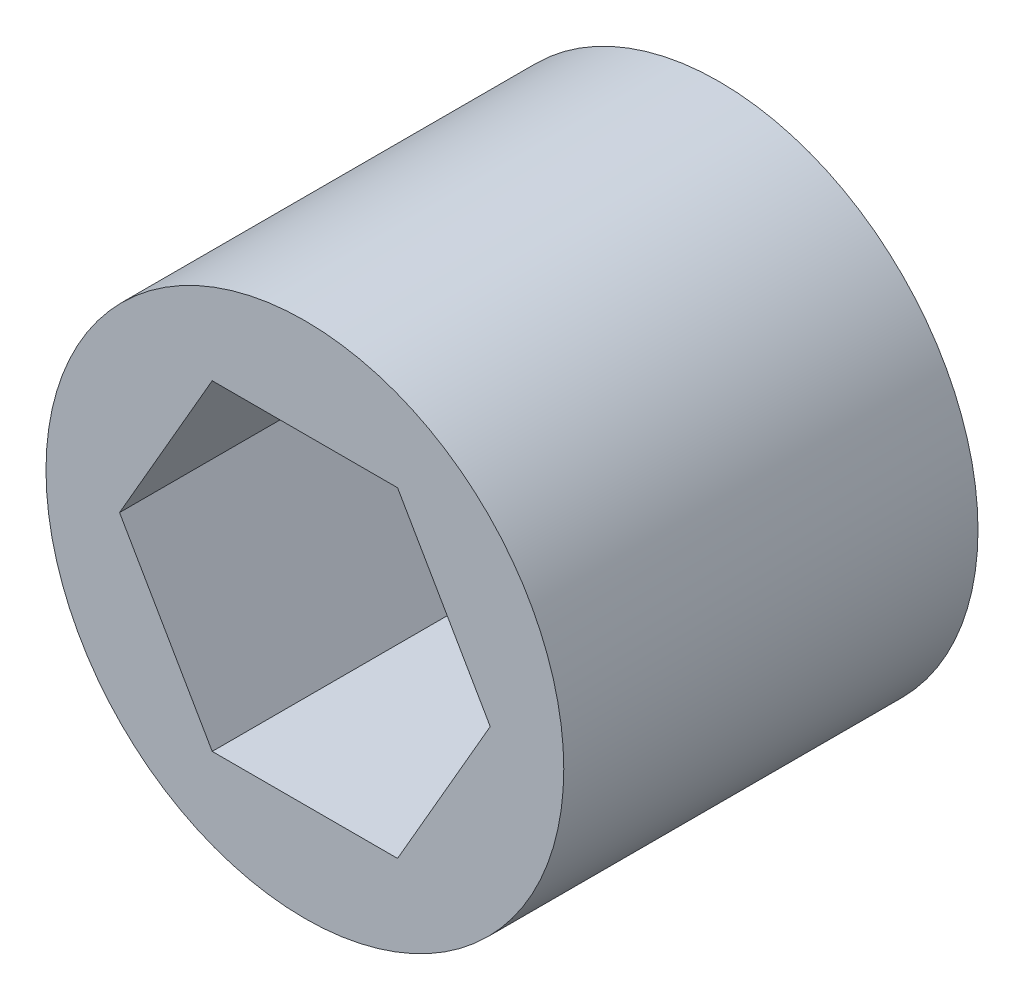
ISO-10303-21;
HEADER;
FILE_DESCRIPTION(('STEP AP214'),'2;1');
FILE_NAME('part.step','',(''),(''),'','','');
FILE_SCHEMA(('AUTOMOTIVE_DESIGN { 1 0 10303 214 1 1 1 1 }'));
ENDSEC;
DATA;
#1=APPLICATION_CONTEXT('core data for automotive mechanical design processes');
#2=APPLICATION_PROTOCOL_DEFINITION('international standard','automotive_design',2000,#1);
#3=PRODUCT_CONTEXT('',#1,'mechanical');
#4=PRODUCT('Part','Part','',(#3));
#5=PRODUCT_RELATED_PRODUCT_CATEGORY('part','',(#4));
#6=PRODUCT_DEFINITION_FORMATION('','',#4);
#7=PRODUCT_DEFINITION_CONTEXT('part definition',#1,'design');
#8=PRODUCT_DEFINITION('design','',#6,#7);
#9=PRODUCT_DEFINITION_SHAPE('','',#8);
#10=(LENGTH_UNIT() NAMED_UNIT(*) SI_UNIT(.MILLI.,.METRE.));
#11=(NAMED_UNIT(*) PLANE_ANGLE_UNIT() SI_UNIT($,.RADIAN.));
#12=(NAMED_UNIT(*) SI_UNIT($,.STERADIAN.) SOLID_ANGLE_UNIT());
#13=UNCERTAINTY_MEASURE_WITH_UNIT(LENGTH_MEASURE(1.E-05),#10,'distance_accuracy_value','');
#14=(GEOMETRIC_REPRESENTATION_CONTEXT(3) GLOBAL_UNCERTAINTY_ASSIGNED_CONTEXT((#13)) GLOBAL_UNIT_ASSIGNED_CONTEXT((#10,
#11,#12)) REPRESENTATION_CONTEXT('',''));
#15=CARTESIAN_POINT('',(0.,0.,0.));
#16=DIRECTION('',(0.,0.,1.));
#17=DIRECTION('',(1.,0.,0.));
#18=AXIS2_PLACEMENT_3D('',#15,#16,#17);
#19=CARTESIAN_POINT('',(0.,0.,8.));
#20=DIRECTION('',(0.,0.,-1.));
#21=DIRECTION('',(-1.,0.,0.));
#22=AXIS2_PLACEMENT_3D('',#19,#20,#21);
#23=CYLINDRICAL_SURFACE('',#22,1.725);
#24=CARTESIAN_POINT('',(0.,0.,0.));
#25=DIRECTION('',(0.,0.,1.));
#26=DIRECTION('',(1.,0.,0.));
#27=AXIS2_PLACEMENT_3D('',#24,#25,#26);
#28=CIRCLE('',#27,1.725);
#29=CARTESIAN_POINT('',(1.725,0.,0.));
#30=VERTEX_POINT('',#29);
#31=EDGE_CURVE('E144',#30,#30,#28,.T.);
#32=ORIENTED_EDGE('',*,*,#31,.F.);
#33=EDGE_LOOP('',(#32));
#34=FACE_BOUND('',#33,.T.);
#35=CARTESIAN_POINT('',(0.,0.,2.7));
#36=DIRECTION('',(0.,0.,1.));
#37=DIRECTION('',(1.,0.,0.));
#38=AXIS2_PLACEMENT_3D('',#35,#36,#37);
#39=CIRCLE('',#38,1.725);
#40=CARTESIAN_POINT('',(1.725,0.,2.7));
#41=VERTEX_POINT('',#40);
#42=EDGE_CURVE('E39',#41,#41,#39,.T.);
#43=ORIENTED_EDGE('',*,*,#42,.T.);
#44=EDGE_LOOP('',(#43));
#45=FACE_BOUND('',#44,.T.);
#46=ADVANCED_FACE('F35',(#34,#45),#23,.F.);
#47=CARTESIAN_POINT('',(0.,0.,8.));
#48=DIRECTION('',(0.,0.,1.));
#49=DIRECTION('',(1.,0.,0.));
#50=AXIS2_PLACEMENT_3D('',#47,#48,#49);
#51=PLANE('',#50);
#52=DIRECTION('',(0.499999999999999,0.866025403784439,0.));
#53=VECTOR('',#52,1.);
#54=CARTESIAN_POINT('',(1.78978583448784,-3.1,8.));
#55=LINE('',#54,#53);
#56=CARTESIAN_POINT('',(1.78978583448784,-3.1,8.));
#57=VERTEX_POINT('',#56);
#58=CARTESIAN_POINT('',(3.57957166897568,0.,8.));
#59=VERTEX_POINT('',#58);
#60=EDGE_CURVE('E52',#57,#59,#55,.T.);
#61=ORIENTED_EDGE('',*,*,#60,.F.);
#62=DIRECTION('',(1.,0.,0.));
#63=VECTOR('',#62,1.);
#64=CARTESIAN_POINT('',(-1.78978583448784,-3.1,8.));
#65=LINE('',#64,#63);
#66=CARTESIAN_POINT('',(-1.78978583448784,-3.1,8.));
#67=VERTEX_POINT('',#66);
#68=EDGE_CURVE('E135',#67,#57,#65,.T.);
#69=ORIENTED_EDGE('',*,*,#68,.F.);
#70=DIRECTION('',(0.5,-0.866025403784438,0.));
#71=VECTOR('',#70,1.);
#72=CARTESIAN_POINT('',(-3.57957166897568,0.,8.));
#73=LINE('',#72,#71);
#74=CARTESIAN_POINT('',(-3.57957166897568,0.,8.));
#75=VERTEX_POINT('',#74);
#76=EDGE_CURVE('E133',#75,#67,#73,.T.);
#77=ORIENTED_EDGE('',*,*,#76,.F.);
#78=DIRECTION('',(-0.499999999999999,-0.866025403784439,0.));
#79=VECTOR('',#78,1.);
#80=CARTESIAN_POINT('',(-1.78978583448784,3.1,8.));
#81=LINE('',#80,#79);
#82=CARTESIAN_POINT('',(-1.78978583448784,3.1,8.));
#83=VERTEX_POINT('',#82);
#84=EDGE_CURVE('E100',#83,#75,#81,.T.);
#85=ORIENTED_EDGE('',*,*,#84,.F.);
#86=DIRECTION('',(-1.,0.,0.));
#87=VECTOR('',#86,1.);
#88=CARTESIAN_POINT('',(1.78978583448784,3.1,8.));
#89=LINE('',#88,#87);
#90=CARTESIAN_POINT('',(1.78978583448784,3.1,8.));
#91=VERTEX_POINT('',#90);
#92=EDGE_CURVE('E129',#91,#83,#89,.T.);
#93=ORIENTED_EDGE('',*,*,#92,.F.);
#94=DIRECTION('',(-0.5,0.866025403784439,0.));
#95=VECTOR('',#94,1.);
#96=CARTESIAN_POINT('',(3.57957166897568,0.,8.));
#97=LINE('',#96,#95);
#98=EDGE_CURVE('E126',#59,#91,#97,.T.);
#99=ORIENTED_EDGE('',*,*,#98,.F.);
#100=EDGE_LOOP('',(#61,#69,#77,#85,#93,#99));
#101=FACE_BOUND('',#100,.T.);
#102=CARTESIAN_POINT('',(0.,0.,8.));
#103=DIRECTION('',(0.,0.,1.));
#104=DIRECTION('',(1.,0.,0.));
#105=AXIS2_PLACEMENT_3D('',#102,#103,#104);
#106=CIRCLE('',#105,5.);
#107=CARTESIAN_POINT('',(5.,0.,8.));
#108=VERTEX_POINT('',#107);
#109=EDGE_CURVE('E11',#108,#108,#106,.T.);
#110=ORIENTED_EDGE('',*,*,#109,.T.);
#111=EDGE_LOOP('',(#110));
#112=FACE_BOUND('',#111,.T.);
#113=ADVANCED_FACE('F153',(#101,#112),#51,.T.);
#114=CARTESIAN_POINT('',(0.,0.,0.));
#115=DIRECTION('',(0.,0.,1.));
#116=DIRECTION('',(1.,0.,0.));
#117=AXIS2_PLACEMENT_3D('',#114,#115,#116);
#118=PLANE('',#117);
#119=CARTESIAN_POINT('',(0.,0.,0.));
#120=DIRECTION('',(0.,0.,1.));
#121=DIRECTION('',(1.,0.,0.));
#122=AXIS2_PLACEMENT_3D('',#119,#120,#121);
#123=CIRCLE('',#122,5.);
#124=CARTESIAN_POINT('',(5.,0.,0.));
#125=VERTEX_POINT('',#124);
#126=EDGE_CURVE('E44',#125,#125,#123,.T.);
#127=ORIENTED_EDGE('',*,*,#126,.F.);
#128=EDGE_LOOP('',(#127));
#129=FACE_BOUND('',#128,.T.);
#130=ORIENTED_EDGE('',*,*,#31,.T.);
#131=EDGE_LOOP('',(#130));
#132=FACE_BOUND('',#131,.T.);
#133=ADVANCED_FACE('F150',(#129,#132),#118,.F.);
#134=CARTESIAN_POINT('',(0.,0.,8.));
#135=DIRECTION('',(0.,0.,-1.));
#136=DIRECTION('',(-1.,0.,0.));
#137=AXIS2_PLACEMENT_3D('',#134,#135,#136);
#138=CYLINDRICAL_SURFACE('',#137,5.);
#139=ORIENTED_EDGE('',*,*,#109,.F.);
#140=EDGE_LOOP('',(#139));
#141=FACE_BOUND('',#140,.T.);
#142=ORIENTED_EDGE('',*,*,#126,.T.);
#143=EDGE_LOOP('',(#142));
#144=FACE_BOUND('',#143,.T.);
#145=ADVANCED_FACE('F37',(#141,#144),#138,.T.);
#146=CARTESIAN_POINT('',(1.78978583448784,-3.1,2.7));
#147=DIRECTION('',(0.866025403784439,-0.499999999999999,0.));
#148=DIRECTION('',(0.499999999999999,0.866025403784439,0.));
#149=AXIS2_PLACEMENT_3D('',#146,#147,#148);
#150=PLANE('',#149);
#151=ORIENTED_EDGE('',*,*,#60,.T.);
#152=DIRECTION('',(0.,0.,1.));
#153=VECTOR('',#152,1.);
#154=CARTESIAN_POINT('',(3.57957166897568,0.,2.7));
#155=LINE('',#154,#153);
#156=CARTESIAN_POINT('',(3.57957166897568,0.,2.7));
#157=VERTEX_POINT('',#156);
#158=EDGE_CURVE('E82',#157,#59,#155,.T.);
#159=ORIENTED_EDGE('',*,*,#158,.F.);
#160=DIRECTION('',(0.499999999999999,0.866025403784439,0.));
#161=VECTOR('',#160,1.);
#162=CARTESIAN_POINT('',(1.78978583448784,-3.1,2.7));
#163=LINE('',#162,#161);
#164=CARTESIAN_POINT('',(1.78978583448784,-3.1,2.7));
#165=VERTEX_POINT('',#164);
#166=EDGE_CURVE('E137',#165,#157,#163,.T.);
#167=ORIENTED_EDGE('',*,*,#166,.F.);
#168=DIRECTION('',(0.,0.,1.));
#169=VECTOR('',#168,1.);
#170=CARTESIAN_POINT('',(1.78978583448784,-3.1,2.7));
#171=LINE('',#170,#169);
#172=EDGE_CURVE('E60',#165,#57,#171,.T.);
#173=ORIENTED_EDGE('',*,*,#172,.T.);
#174=EDGE_LOOP('',(#151,#159,#167,#173));
#175=FACE_BOUND('',#174,.T.);
#176=ADVANCED_FACE('F175',(#175),#150,.F.);
#177=CARTESIAN_POINT('',(-1.78978583448784,-3.1,2.7));
#178=DIRECTION('',(0.,-1.,0.));
#179=DIRECTION('',(1.,0.,0.));
#180=AXIS2_PLACEMENT_3D('',#177,#178,#179);
#181=PLANE('',#180);
#182=ORIENTED_EDGE('',*,*,#68,.T.);
#183=ORIENTED_EDGE('',*,*,#172,.F.);
#184=DIRECTION('',(1.,0.,0.));
#185=VECTOR('',#184,1.);
#186=CARTESIAN_POINT('',(-1.78978583448784,-3.1,2.7));
#187=LINE('',#186,#185);
#188=CARTESIAN_POINT('',(-1.78978583448784,-3.1,2.7));
#189=VERTEX_POINT('',#188);
#190=EDGE_CURVE('E112',#189,#165,#187,.T.);
#191=ORIENTED_EDGE('',*,*,#190,.F.);
#192=DIRECTION('',(0.,0.,1.));
#193=VECTOR('',#192,1.);
#194=CARTESIAN_POINT('',(-1.78978583448784,-3.1,2.7));
#195=LINE('',#194,#193);
#196=EDGE_CURVE('E104',#189,#67,#195,.T.);
#197=ORIENTED_EDGE('',*,*,#196,.T.);
#198=EDGE_LOOP('',(#182,#183,#191,#197));
#199=FACE_BOUND('',#198,.T.);
#200=ADVANCED_FACE('F172',(#199),#181,.F.);
#201=CARTESIAN_POINT('',(-3.57957166897568,0.,2.7));
#202=DIRECTION('',(-0.866025403784438,-0.5,0.));
#203=DIRECTION('',(0.5,-0.866025403784439,0.));
#204=AXIS2_PLACEMENT_3D('',#201,#202,#203);
#205=PLANE('',#204);
#206=ORIENTED_EDGE('',*,*,#76,.T.);
#207=ORIENTED_EDGE('',*,*,#196,.F.);
#208=DIRECTION('',(0.5,-0.866025403784438,0.));
#209=VECTOR('',#208,1.);
#210=CARTESIAN_POINT('',(-3.57957166897568,0.,2.7));
#211=LINE('',#210,#209);
#212=CARTESIAN_POINT('',(-3.57957166897568,0.,2.7));
#213=VERTEX_POINT('',#212);
#214=EDGE_CURVE('E108',#213,#189,#211,.T.);
#215=ORIENTED_EDGE('',*,*,#214,.F.);
#216=DIRECTION('',(0.,0.,1.));
#217=VECTOR('',#216,1.);
#218=CARTESIAN_POINT('',(-3.57957166897568,0.,2.7));
#219=LINE('',#218,#217);
#220=EDGE_CURVE('E93',#213,#75,#219,.T.);
#221=ORIENTED_EDGE('',*,*,#220,.T.);
#222=EDGE_LOOP('',(#206,#207,#215,#221));
#223=FACE_BOUND('',#222,.T.);
#224=ADVANCED_FACE('F109',(#223),#205,.F.);
#225=CARTESIAN_POINT('',(-1.78978583448784,3.1,2.7));
#226=DIRECTION('',(-0.866025403784439,0.499999999999999,0.));
#227=DIRECTION('',(-0.499999999999999,-0.866025403784439,0.));
#228=AXIS2_PLACEMENT_3D('',#225,#226,#227);
#229=PLANE('',#228);
#230=ORIENTED_EDGE('',*,*,#84,.T.);
#231=ORIENTED_EDGE('',*,*,#220,.F.);
#232=DIRECTION('',(-0.499999999999999,-0.866025403784439,0.));
#233=VECTOR('',#232,1.);
#234=CARTESIAN_POINT('',(-1.78978583448784,3.1,2.7));
#235=LINE('',#234,#233);
#236=CARTESIAN_POINT('',(-1.78978583448784,3.1,2.7));
#237=VERTEX_POINT('',#236);
#238=EDGE_CURVE('E97',#237,#213,#235,.T.);
#239=ORIENTED_EDGE('',*,*,#238,.F.);
#240=DIRECTION('',(0.,0.,1.));
#241=VECTOR('',#240,1.);
#242=CARTESIAN_POINT('',(-1.78978583448784,3.1,2.7));
#243=LINE('',#242,#241);
#244=EDGE_CURVE('E105',#237,#83,#243,.T.);
#245=ORIENTED_EDGE('',*,*,#244,.T.);
#246=EDGE_LOOP('',(#230,#231,#239,#245));
#247=FACE_BOUND('',#246,.T.);
#248=ADVANCED_FACE('F95',(#247),#229,.F.);
#249=CARTESIAN_POINT('',(1.78978583448784,3.1,2.7));
#250=DIRECTION('',(0.,1.,0.));
#251=DIRECTION('',(0.,0.,1.));
#252=AXIS2_PLACEMENT_3D('',#249,#250,#251);
#253=PLANE('',#252);
#254=ORIENTED_EDGE('',*,*,#92,.T.);
#255=ORIENTED_EDGE('',*,*,#244,.F.);
#256=DIRECTION('',(-1.,0.,0.));
#257=VECTOR('',#256,1.);
#258=CARTESIAN_POINT('',(1.78978583448784,3.1,2.7));
#259=LINE('',#258,#257);
#260=CARTESIAN_POINT('',(1.78978583448784,3.1,2.7));
#261=VERTEX_POINT('',#260);
#262=EDGE_CURVE('E118',#261,#237,#259,.T.);
#263=ORIENTED_EDGE('',*,*,#262,.F.);
#264=DIRECTION('',(0.,0.,1.));
#265=VECTOR('',#264,1.);
#266=CARTESIAN_POINT('',(1.78978583448784,3.1,2.7));
#267=LINE('',#266,#265);
#268=EDGE_CURVE('E141',#261,#91,#267,.T.);
#269=ORIENTED_EDGE('',*,*,#268,.T.);
#270=EDGE_LOOP('',(#254,#255,#263,#269));
#271=FACE_BOUND('',#270,.T.);
#272=ADVANCED_FACE('F168',(#271),#253,.F.);
#273=CARTESIAN_POINT('',(3.57957166897568,0.,2.7));
#274=DIRECTION('',(0.866025403784439,0.5,0.));
#275=DIRECTION('',(-0.5,0.866025403784439,0.));
#276=AXIS2_PLACEMENT_3D('',#273,#274,#275);
#277=PLANE('',#276);
#278=ORIENTED_EDGE('',*,*,#98,.T.);
#279=ORIENTED_EDGE('',*,*,#268,.F.);
#280=DIRECTION('',(-0.5,0.866025403784439,0.));
#281=VECTOR('',#280,1.);
#282=CARTESIAN_POINT('',(3.57957166897568,0.,2.7));
#283=LINE('',#282,#281);
#284=EDGE_CURVE('E120',#157,#261,#283,.T.);
#285=ORIENTED_EDGE('',*,*,#284,.F.);
#286=ORIENTED_EDGE('',*,*,#158,.T.);
#287=EDGE_LOOP('',(#278,#279,#285,#286));
#288=FACE_BOUND('',#287,.T.);
#289=ADVANCED_FACE('F163',(#288),#277,.F.);
#290=CARTESIAN_POINT('',(0.,0.,2.7));
#291=DIRECTION('',(0.,0.,1.));
#292=DIRECTION('',(1.,0.,0.));
#293=AXIS2_PLACEMENT_3D('',#290,#291,#292);
#294=PLANE('',#293);
#295=ORIENTED_EDGE('',*,*,#42,.F.);
#296=EDGE_LOOP('',(#295));
#297=FACE_BOUND('',#296,.T.);
#298=ORIENTED_EDGE('',*,*,#166,.T.);
#299=ORIENTED_EDGE('',*,*,#284,.T.);
#300=ORIENTED_EDGE('',*,*,#262,.T.);
#301=ORIENTED_EDGE('',*,*,#238,.T.);
#302=ORIENTED_EDGE('',*,*,#214,.T.);
#303=ORIENTED_EDGE('',*,*,#190,.T.);
#304=EDGE_LOOP('',(#298,#299,#300,#301,#302,#303));
#305=FACE_BOUND('',#304,.T.);
#306=ADVANCED_FACE('F115',(#297,#305),#294,.T.);
#307=CLOSED_SHELL('',(#46,#113,#133,#145,#176,#200,#224,#248,#272,#289,#306));
#308=MANIFOLD_SOLID_BREP('B2',#307);
#309=ADVANCED_BREP_SHAPE_REPRESENTATION('',(#18,#308),#14);
#310=SHAPE_DEFINITION_REPRESENTATION(#9,#309);
ENDSEC;
END-ISO-10303-21;
